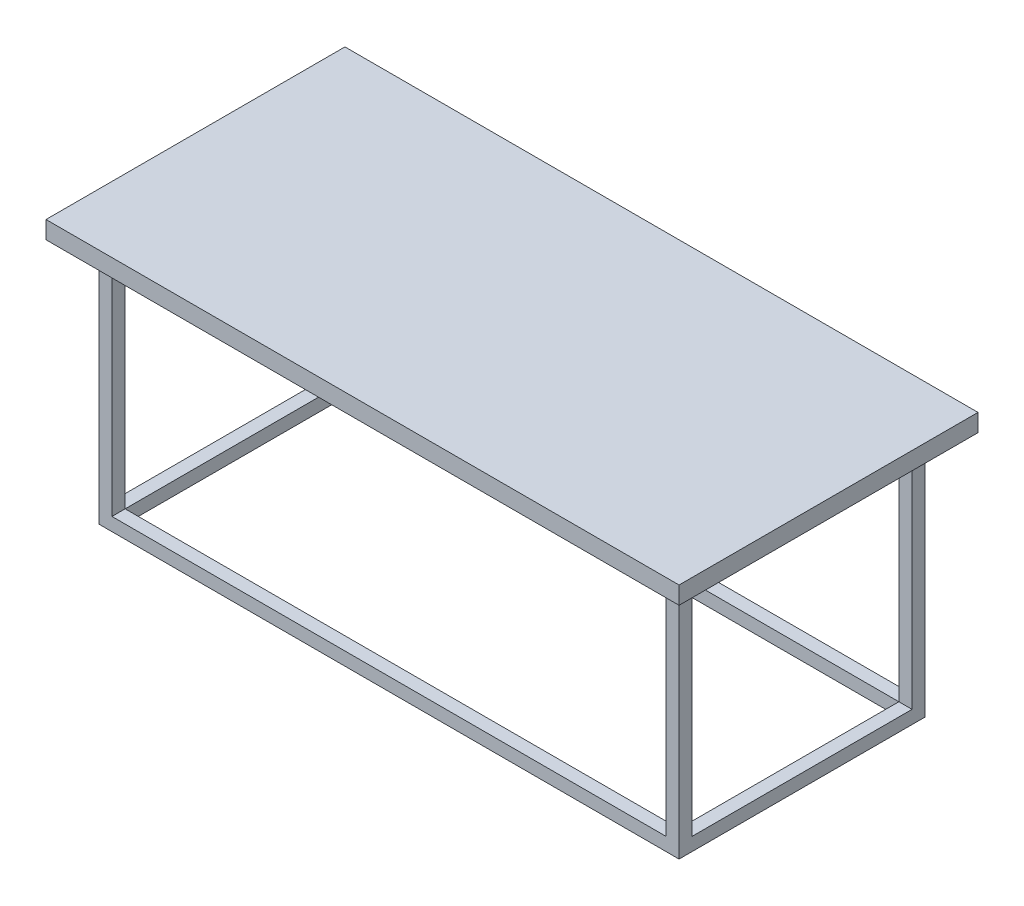
ISO-10303-21;
HEADER;
FILE_DESCRIPTION(('STEP AP214'),'2;1');
FILE_NAME('part.step','',(''),(''),'','','');
FILE_SCHEMA(('AUTOMOTIVE_DESIGN { 1 0 10303 214 1 1 1 1 }'));
ENDSEC;
DATA;
#1=APPLICATION_CONTEXT('core data for automotive mechanical design processes');
#2=APPLICATION_PROTOCOL_DEFINITION('international standard','automotive_design',2000,#1);
#3=PRODUCT_CONTEXT('',#1,'mechanical');
#4=PRODUCT('Part','Part','',(#3));
#5=PRODUCT_RELATED_PRODUCT_CATEGORY('part','',(#4));
#6=PRODUCT_DEFINITION_FORMATION('','',#4);
#7=PRODUCT_DEFINITION_CONTEXT('part definition',#1,'design');
#8=PRODUCT_DEFINITION('design','',#6,#7);
#9=PRODUCT_DEFINITION_SHAPE('','',#8);
#10=(LENGTH_UNIT() NAMED_UNIT(*) SI_UNIT(.MILLI.,.METRE.));
#11=(NAMED_UNIT(*) PLANE_ANGLE_UNIT() SI_UNIT($,.RADIAN.));
#12=(NAMED_UNIT(*) SI_UNIT($,.STERADIAN.) SOLID_ANGLE_UNIT());
#13=UNCERTAINTY_MEASURE_WITH_UNIT(LENGTH_MEASURE(1.E-05),#10,'distance_accuracy_value','');
#14=(GEOMETRIC_REPRESENTATION_CONTEXT(3) GLOBAL_UNCERTAINTY_ASSIGNED_CONTEXT((#13)) GLOBAL_UNIT_ASSIGNED_CONTEXT((#10,
#11,#12)) REPRESENTATION_CONTEXT('',''));
#15=CARTESIAN_POINT('',(0.,0.,0.));
#16=DIRECTION('',(0.,0.,1.));
#17=DIRECTION('',(1.,0.,0.));
#18=AXIS2_PLACEMENT_3D('',#15,#16,#17);
#19=CARTESIAN_POINT('',(-838.2,-711.2,317.5));
#20=DIRECTION('',(0.,0.,1.));
#21=DIRECTION('',(1.,0.,0.));
#22=AXIS2_PLACEMENT_3D('',#19,#20,#21);
#23=PLANE('',#22);
#24=DIRECTION('',(0.,-1.,0.));
#25=VECTOR('',#24,1.);
#26=CARTESIAN_POINT('',(800.1000000001,-711.2,317.499999999995));
#27=LINE('',#26,#25);
#28=CARTESIAN_POINT('',(800.1000000001,-673.1,317.499999999995));
#29=VERTEX_POINT('',#28);
#30=CARTESIAN_POINT('',(800.1000000001,-711.2,317.499999999995));
#31=VERTEX_POINT('',#30);
#32=EDGE_CURVE('E203',#29,#31,#27,.T.);
#33=ORIENTED_EDGE('',*,*,#32,.T.);
#34=DIRECTION('',(1.,0.,0.));
#35=VECTOR('',#34,1.);
#36=CARTESIAN_POINT('',(-838.2,-711.2,317.5));
#37=LINE('',#36,#35);
#38=CARTESIAN_POINT('',(-800.1,-711.2,317.5));
#39=VERTEX_POINT('',#38);
#40=EDGE_CURVE('E277',#39,#31,#37,.T.);
#41=ORIENTED_EDGE('',*,*,#40,.F.);
#42=DIRECTION('',(0.,1.,0.));
#43=VECTOR('',#42,1.);
#44=CARTESIAN_POINT('',(-800.1,-711.2,317.499999999995));
#45=LINE('',#44,#43);
#46=CARTESIAN_POINT('',(-800.1,-673.1,317.499999999995));
#47=VERTEX_POINT('',#46);
#48=EDGE_CURVE('E833',#39,#47,#45,.T.);
#49=ORIENTED_EDGE('',*,*,#48,.T.);
#50=DIRECTION('',(-1.,0.,0.));
#51=VECTOR('',#50,1.);
#52=CARTESIAN_POINT('',(500000.,-673.1,317.5));
#53=LINE('',#52,#51);
#54=EDGE_CURVE('E422',#29,#47,#53,.T.);
#55=ORIENTED_EDGE('',*,*,#54,.F.);
#56=EDGE_LOOP('',(#33,#41,#49,#55));
#57=FACE_BOUND('',#56,.T.);
#58=ADVANCED_FACE('F36',(#57),#23,.F.);
#59=DIRECTION('',(-1.,0.,0.));
#60=VECTOR('',#59,1.);
#61=CARTESIAN_POINT('',(838.2,-673.1,317.499999999995));
#62=LINE('',#61,#60);
#63=CARTESIAN_POINT('',(838.2,-673.1,317.499999999995));
#64=VERTEX_POINT('',#63);
#65=EDGE_CURVE('E842',#64,#29,#62,.T.);
#66=ORIENTED_EDGE('',*,*,#65,.T.);
#67=DIRECTION('',(0.,1.,0.));
#68=VECTOR('',#67,1.);
#69=CARTESIAN_POINT('',(800.1,-711.2,317.5));
#70=LINE('',#69,#68);
#71=CARTESIAN_POINT('',(800.1,-50.8,317.5));
#72=VERTEX_POINT('',#71);
#73=EDGE_CURVE('E270',#29,#72,#70,.T.);
#74=ORIENTED_EDGE('',*,*,#73,.T.);
#75=DIRECTION('',(1.,0.,0.));
#76=VECTOR('',#75,1.);
#77=CARTESIAN_POINT('',(838.2,-50.8,317.5));
#78=LINE('',#77,#76);
#79=CARTESIAN_POINT('',(838.2,-50.8,317.5));
#80=VERTEX_POINT('',#79);
#81=EDGE_CURVE('E264',#72,#80,#78,.T.);
#82=ORIENTED_EDGE('',*,*,#81,.T.);
#83=DIRECTION('',(0.,1.,0.));
#84=VECTOR('',#83,1.);
#85=CARTESIAN_POINT('',(838.2,-711.2,317.5));
#86=LINE('',#85,#84);
#87=EDGE_CURVE('E263',#64,#80,#86,.T.);
#88=ORIENTED_EDGE('',*,*,#87,.F.);
#89=EDGE_LOOP('',(#66,#74,#82,#88));
#90=FACE_BOUND('',#89,.T.);
#91=ADVANCED_FACE('F522',(#90),#23,.F.);
#92=CARTESIAN_POINT('',(800.1,-711.2,-317.5));
#93=DIRECTION('',(0.,0.,-1.));
#94=DIRECTION('',(-1.,0.,0.));
#95=AXIS2_PLACEMENT_3D('',#92,#93,#94);
#96=PLANE('',#95);
#97=DIRECTION('',(0.,-1.,0.));
#98=VECTOR('',#97,1.);
#99=CARTESIAN_POINT('',(800.1000000001,-711.2,-317.5));
#100=LINE('',#99,#98);
#101=CARTESIAN_POINT('',(800.1000000001,-673.1,-317.5));
#102=VERTEX_POINT('',#101);
#103=CARTESIAN_POINT('',(800.1000000001,-711.2,-317.5));
#104=VERTEX_POINT('',#103);
#105=EDGE_CURVE('E54',#102,#104,#100,.T.);
#106=ORIENTED_EDGE('',*,*,#105,.F.);
#107=DIRECTION('',(-1.,0.,0.));
#108=VECTOR('',#107,1.);
#109=CARTESIAN_POINT('',(500000.,-673.1,-317.5));
#110=LINE('',#109,#108);
#111=CARTESIAN_POINT('',(-800.1,-673.1,-317.5));
#112=VERTEX_POINT('',#111);
#113=EDGE_CURVE('E223',#102,#112,#110,.T.);
#114=ORIENTED_EDGE('',*,*,#113,.T.);
#115=DIRECTION('',(0.,1.,0.));
#116=VECTOR('',#115,1.);
#117=CARTESIAN_POINT('',(-800.1,-711.2,-317.5));
#118=LINE('',#117,#116);
#119=CARTESIAN_POINT('',(-800.1,-711.2,-317.5));
#120=VERTEX_POINT('',#119);
#121=EDGE_CURVE('E845',#120,#112,#118,.T.);
#122=ORIENTED_EDGE('',*,*,#121,.F.);
#123=DIRECTION('',(-1.,0.,0.));
#124=VECTOR('',#123,1.);
#125=CARTESIAN_POINT('',(800.1,-711.2,-317.5));
#126=LINE('',#125,#124);
#127=EDGE_CURVE('E225',#104,#120,#126,.T.);
#128=ORIENTED_EDGE('',*,*,#127,.F.);
#129=EDGE_LOOP('',(#106,#114,#122,#128));
#130=FACE_BOUND('',#129,.T.);
#131=ADVANCED_FACE('F221',(#130),#96,.F.);
#132=DIRECTION('',(-1.,0.,0.));
#133=VECTOR('',#132,1.);
#134=CARTESIAN_POINT('',(838.2,-673.1,-317.5));
#135=LINE('',#134,#133);
#136=CARTESIAN_POINT('',(838.2,-673.1,-317.5));
#137=VERTEX_POINT('',#136);
#138=EDGE_CURVE('E210',#137,#102,#135,.T.);
#139=ORIENTED_EDGE('',*,*,#138,.F.);
#140=DIRECTION('',(0.,1.,0.));
#141=VECTOR('',#140,1.);
#142=CARTESIAN_POINT('',(838.2,-711.2,-317.5));
#143=LINE('',#142,#141);
#144=CARTESIAN_POINT('',(838.2,-50.8,-317.5));
#145=VERTEX_POINT('',#144);
#146=EDGE_CURVE('E250',#137,#145,#143,.T.);
#147=ORIENTED_EDGE('',*,*,#146,.T.);
#148=DIRECTION('',(-1.,0.,0.));
#149=VECTOR('',#148,1.);
#150=CARTESIAN_POINT('',(800.1,-50.8,-317.5));
#151=LINE('',#150,#149);
#152=CARTESIAN_POINT('',(800.1,-50.8,-317.5));
#153=VERTEX_POINT('',#152);
#154=EDGE_CURVE('E249',#145,#153,#151,.T.);
#155=ORIENTED_EDGE('',*,*,#154,.T.);
#156=DIRECTION('',(0.,1.,0.));
#157=VECTOR('',#156,1.);
#158=CARTESIAN_POINT('',(800.1,-711.2,-317.5));
#159=LINE('',#158,#157);
#160=EDGE_CURVE('E241',#102,#153,#159,.T.);
#161=ORIENTED_EDGE('',*,*,#160,.F.);
#162=EDGE_LOOP('',(#139,#147,#155,#161));
#163=FACE_BOUND('',#162,.T.);
#164=ADVANCED_FACE('F247',(#163),#96,.F.);
#165=DIRECTION('',(-1.,0.,0.));
#166=VECTOR('',#165,1.);
#167=CARTESIAN_POINT('',(-838.2,-673.1,317.499999999995));
#168=LINE('',#167,#166);
#169=CARTESIAN_POINT('',(-838.2,-673.1,317.499999999995));
#170=VERTEX_POINT('',#169);
#171=EDGE_CURVE('E435',#47,#170,#168,.T.);
#172=ORIENTED_EDGE('',*,*,#171,.T.);
#173=DIRECTION('',(0.,1.,0.));
#174=VECTOR('',#173,1.);
#175=CARTESIAN_POINT('',(-838.2,-711.2,317.5));
#176=LINE('',#175,#174);
#177=CARTESIAN_POINT('',(-838.2,-50.8,317.5));
#178=VERTEX_POINT('',#177);
#179=EDGE_CURVE('E40',#170,#178,#176,.T.);
#180=ORIENTED_EDGE('',*,*,#179,.T.);
#181=DIRECTION('',(1.,0.,0.));
#182=VECTOR('',#181,1.);
#183=CARTESIAN_POINT('',(-838.2,-50.8,317.5));
#184=LINE('',#183,#182);
#185=CARTESIAN_POINT('',(-800.1,-50.8,317.5));
#186=VERTEX_POINT('',#185);
#187=EDGE_CURVE('E274',#178,#186,#184,.T.);
#188=ORIENTED_EDGE('',*,*,#187,.T.);
#189=DIRECTION('',(0.,1.,0.));
#190=VECTOR('',#189,1.);
#191=CARTESIAN_POINT('',(-800.1,-711.2,317.5));
#192=LINE('',#191,#190);
#193=EDGE_CURVE('E286',#47,#186,#192,.T.);
#194=ORIENTED_EDGE('',*,*,#193,.F.);
#195=EDGE_LOOP('',(#172,#180,#188,#194));
#196=FACE_BOUND('',#195,.T.);
#197=ADVANCED_FACE('F350',(#196),#23,.F.);
#198=DIRECTION('',(-1.,0.,0.));
#199=VECTOR('',#198,1.);
#200=CARTESIAN_POINT('',(-838.2,-673.1,-317.5));
#201=LINE('',#200,#199);
#202=CARTESIAN_POINT('',(-838.2,-673.1,-317.5));
#203=VERTEX_POINT('',#202);
#204=EDGE_CURVE('E244',#112,#203,#201,.T.);
#205=ORIENTED_EDGE('',*,*,#204,.F.);
#206=DIRECTION('',(0.,1.,0.));
#207=VECTOR('',#206,1.);
#208=CARTESIAN_POINT('',(-800.1,-711.2,-317.5));
#209=LINE('',#208,#207);
#210=CARTESIAN_POINT('',(-800.1,-50.8,-317.5));
#211=VERTEX_POINT('',#210);
#212=EDGE_CURVE('E368',#112,#211,#209,.T.);
#213=ORIENTED_EDGE('',*,*,#212,.T.);
#214=DIRECTION('',(-1.,0.,0.));
#215=VECTOR('',#214,1.);
#216=CARTESIAN_POINT('',(-838.2,-50.8,-317.5));
#217=LINE('',#216,#215);
#218=CARTESIAN_POINT('',(-838.2,-50.8,-317.5));
#219=VERTEX_POINT('',#218);
#220=EDGE_CURVE('E369',#211,#219,#217,.T.);
#221=ORIENTED_EDGE('',*,*,#220,.T.);
#222=DIRECTION('',(0.,1.,0.));
#223=VECTOR('',#222,1.);
#224=CARTESIAN_POINT('',(-838.2,-711.2,-317.5));
#225=LINE('',#224,#223);
#226=EDGE_CURVE('E363',#203,#219,#225,.T.);
#227=ORIENTED_EDGE('',*,*,#226,.F.);
#228=EDGE_LOOP('',(#205,#213,#221,#227));
#229=FACE_BOUND('',#228,.T.);
#230=ADVANCED_FACE('F532',(#229),#96,.F.);
#231=CARTESIAN_POINT('',(800.1,-711.2,-317.5));
#232=DIRECTION('',(1.,0.,0.));
#233=DIRECTION('',(0.,0.,-1.));
#234=AXIS2_PLACEMENT_3D('',#231,#232,#233);
#235=PLANE('',#234);
#236=DIRECTION('',(0.,0.,1.));
#237=VECTOR('',#236,1.);
#238=CARTESIAN_POINT('',(800.099999999986,-673.1,-317.5));
#239=LINE('',#238,#237);
#240=CARTESIAN_POINT('',(800.1000000001,-673.1,-355.6));
#241=VERTEX_POINT('',#240);
#242=EDGE_CURVE('E230',#241,#102,#239,.T.);
#243=ORIENTED_EDGE('',*,*,#242,.T.);
#244=ORIENTED_EDGE('',*,*,#160,.T.);
#245=DIRECTION('',(0.,0.,-1.));
#246=VECTOR('',#245,1.);
#247=CARTESIAN_POINT('',(800.1,-50.8,-317.5));
#248=LINE('',#247,#246);
#249=CARTESIAN_POINT('',(800.1,-50.8,-355.6));
#250=VERTEX_POINT('',#249);
#251=EDGE_CURVE('E378',#153,#250,#248,.T.);
#252=ORIENTED_EDGE('',*,*,#251,.T.);
#253=DIRECTION('',(0.,1.,0.));
#254=VECTOR('',#253,1.);
#255=CARTESIAN_POINT('',(800.1,-711.2,-355.6));
#256=LINE('',#255,#254);
#257=EDGE_CURVE('E243',#241,#250,#256,.T.);
#258=ORIENTED_EDGE('',*,*,#257,.F.);
#259=EDGE_LOOP('',(#243,#244,#252,#258));
#260=FACE_BOUND('',#259,.T.);
#261=ADVANCED_FACE('F239',(#260),#235,.F.);
#262=CARTESIAN_POINT('',(-800.1,-711.2,-355.6));
#263=DIRECTION('',(-1.,0.,0.));
#264=DIRECTION('',(0.,0.,1.));
#265=AXIS2_PLACEMENT_3D('',#262,#263,#264);
#266=PLANE('',#265);
#267=DIRECTION('',(0.,0.,1.));
#268=VECTOR('',#267,1.);
#269=CARTESIAN_POINT('',(-800.1,-673.1,-317.5));
#270=LINE('',#269,#268);
#271=CARTESIAN_POINT('',(-800.1,-673.1,-355.6));
#272=VERTEX_POINT('',#271);
#273=EDGE_CURVE('E233',#272,#112,#270,.T.);
#274=ORIENTED_EDGE('',*,*,#273,.F.);
#275=DIRECTION('',(0.,1.,0.));
#276=VECTOR('',#275,1.);
#277=CARTESIAN_POINT('',(-800.1,-711.2,-355.6));
#278=LINE('',#277,#276);
#279=CARTESIAN_POINT('',(-800.1,-50.8,-355.6));
#280=VERTEX_POINT('',#279);
#281=EDGE_CURVE('E371',#272,#280,#278,.T.);
#282=ORIENTED_EDGE('',*,*,#281,.T.);
#283=DIRECTION('',(0.,0.,1.));
#284=VECTOR('',#283,1.);
#285=CARTESIAN_POINT('',(-800.1,-50.8,-355.6));
#286=LINE('',#285,#284);
#287=EDGE_CURVE('E373',#280,#211,#286,.T.);
#288=ORIENTED_EDGE('',*,*,#287,.T.);
#289=ORIENTED_EDGE('',*,*,#212,.F.);
#290=EDGE_LOOP('',(#274,#282,#288,#289));
#291=FACE_BOUND('',#290,.T.);
#292=ADVANCED_FACE('F440',(#291),#266,.F.);
#293=CARTESIAN_POINT('',(-800.1,-711.2,355.6));
#294=DIRECTION('',(-1.,0.,0.));
#295=DIRECTION('',(0.,0.,1.));
#296=AXIS2_PLACEMENT_3D('',#293,#294,#295);
#297=PLANE('',#296);
#298=DIRECTION('',(0.,0.,1.));
#299=VECTOR('',#298,1.);
#300=CARTESIAN_POINT('',(-800.1,-673.1,355.6));
#301=LINE('',#300,#299);
#302=CARTESIAN_POINT('',(-800.1,-673.1,355.6));
#303=VERTEX_POINT('',#302);
#304=EDGE_CURVE('E417',#47,#303,#301,.T.);
#305=ORIENTED_EDGE('',*,*,#304,.F.);
#306=ORIENTED_EDGE('',*,*,#193,.T.);
#307=DIRECTION('',(0.,0.,1.));
#308=VECTOR('',#307,1.);
#309=CARTESIAN_POINT('',(-800.1,-50.8,355.6));
#310=LINE('',#309,#308);
#311=CARTESIAN_POINT('',(-800.1,-50.8,355.6));
#312=VERTEX_POINT('',#311);
#313=EDGE_CURVE('E278',#186,#312,#310,.T.);
#314=ORIENTED_EDGE('',*,*,#313,.T.);
#315=DIRECTION('',(0.,1.,0.));
#316=VECTOR('',#315,1.);
#317=CARTESIAN_POINT('',(-800.1,-711.2,355.6));
#318=LINE('',#317,#316);
#319=EDGE_CURVE('E283',#303,#312,#318,.T.);
#320=ORIENTED_EDGE('',*,*,#319,.F.);
#321=EDGE_LOOP('',(#305,#306,#314,#320));
#322=FACE_BOUND('',#321,.T.);
#323=ADVANCED_FACE('F415',(#322),#297,.F.);
#324=CARTESIAN_POINT('',(800.1,-711.2,355.6));
#325=DIRECTION('',(1.,0.,0.));
#326=DIRECTION('',(0.,0.,-1.));
#327=AXIS2_PLACEMENT_3D('',#324,#325,#326);
#328=PLANE('',#327);
#329=DIRECTION('',(0.,0.,1.));
#330=VECTOR('',#329,1.);
#331=CARTESIAN_POINT('',(800.099999999986,-673.1,355.6));
#332=LINE('',#331,#330);
#333=CARTESIAN_POINT('',(800.1000000001,-673.1,355.6));
#334=VERTEX_POINT('',#333);
#335=EDGE_CURVE('E425',#29,#334,#332,.T.);
#336=ORIENTED_EDGE('',*,*,#335,.T.);
#337=DIRECTION('',(0.,1.,0.));
#338=VECTOR('',#337,1.);
#339=CARTESIAN_POINT('',(800.1,-711.2,355.6));
#340=LINE('',#339,#338);
#341=CARTESIAN_POINT('',(800.1,-50.8,355.6));
#342=VERTEX_POINT('',#341);
#343=EDGE_CURVE('E272',#334,#342,#340,.T.);
#344=ORIENTED_EDGE('',*,*,#343,.T.);
#345=DIRECTION('',(0.,0.,-1.));
#346=VECTOR('',#345,1.);
#347=CARTESIAN_POINT('',(800.1,-50.8,355.6));
#348=LINE('',#347,#346);
#349=EDGE_CURVE('E259',#342,#72,#348,.T.);
#350=ORIENTED_EDGE('',*,*,#349,.T.);
#351=ORIENTED_EDGE('',*,*,#73,.F.);
#352=EDGE_LOOP('',(#336,#344,#350,#351));
#353=FACE_BOUND('',#352,.T.);
#354=ADVANCED_FACE('F546',(#353),#328,.F.);
#355=CARTESIAN_POINT('',(0.,-50.8,0.));
#356=DIRECTION('',(0.,-1.,0.));
#357=DIRECTION('',(0.,0.,-1.));
#358=AXIS2_PLACEMENT_3D('',#355,#356,#357);
#359=PLANE('',#358);
#360=DIRECTION('',(1.,0.,0.));
#361=VECTOR('',#360,1.);
#362=CARTESIAN_POINT('',(800.1,-50.8,-317.5));
#363=LINE('',#362,#361);
#364=EDGE_CURVE('E321',#211,#153,#363,.T.);
#365=ORIENTED_EDGE('',*,*,#364,.F.);
#366=ORIENTED_EDGE('',*,*,#287,.F.);
#367=DIRECTION('',(1.,0.,0.));
#368=VECTOR('',#367,1.);
#369=CARTESIAN_POINT('',(838.2,-50.8,-355.6));
#370=LINE('',#369,#368);
#371=EDGE_CURVE('E341',#280,#250,#370,.T.);
#372=ORIENTED_EDGE('',*,*,#371,.T.);
#373=ORIENTED_EDGE('',*,*,#251,.F.);
#374=EDGE_LOOP('',(#365,#366,#372,#373));
#375=FACE_BOUND('',#374,.T.);
#376=ADVANCED_FACE('F384',(#375),#359,.T.);
#377=DIRECTION('',(0.,0.,-1.));
#378=VECTOR('',#377,1.);
#379=CARTESIAN_POINT('',(-838.2,-50.8,-355.6));
#380=LINE('',#379,#378);
#381=EDGE_CURVE('E344',#178,#219,#380,.T.);
#382=ORIENTED_EDGE('',*,*,#381,.T.);
#383=ORIENTED_EDGE('',*,*,#220,.F.);
#384=DIRECTION('',(0.,0.,-1.));
#385=VECTOR('',#384,1.);
#386=CARTESIAN_POINT('',(-800.1,-50.8,-317.5));
#387=LINE('',#386,#385);
#388=EDGE_CURVE('E357',#186,#211,#387,.T.);
#389=ORIENTED_EDGE('',*,*,#388,.F.);
#390=ORIENTED_EDGE('',*,*,#187,.F.);
#391=EDGE_LOOP('',(#382,#383,#389,#390));
#392=FACE_BOUND('',#391,.T.);
#393=ADVANCED_FACE('F353',(#392),#359,.T.);
#394=DIRECTION('',(0.,0.,1.));
#395=VECTOR('',#394,1.);
#396=CARTESIAN_POINT('',(800.1,-50.8,-317.5));
#397=LINE('',#396,#395);
#398=EDGE_CURVE('E328',#153,#72,#397,.T.);
#399=ORIENTED_EDGE('',*,*,#398,.F.);
#400=ORIENTED_EDGE('',*,*,#154,.F.);
#401=DIRECTION('',(0.,0.,1.));
#402=VECTOR('',#401,1.);
#403=CARTESIAN_POINT('',(838.2,-50.8,-355.6));
#404=LINE('',#403,#402);
#405=EDGE_CURVE('E443',#145,#80,#404,.T.);
#406=ORIENTED_EDGE('',*,*,#405,.T.);
#407=ORIENTED_EDGE('',*,*,#81,.F.);
#408=EDGE_LOOP('',(#399,#400,#406,#407));
#409=FACE_BOUND('',#408,.T.);
#410=ADVANCED_FACE('F400',(#409),#359,.T.);
#411=DIRECTION('',(-1.,0.,0.));
#412=VECTOR('',#411,1.);
#413=CARTESIAN_POINT('',(800.1,-50.8,317.5));
#414=LINE('',#413,#412);
#415=EDGE_CURVE('E402',#72,#186,#414,.T.);
#416=ORIENTED_EDGE('',*,*,#415,.F.);
#417=ORIENTED_EDGE('',*,*,#349,.F.);
#418=DIRECTION('',(-1.,0.,0.));
#419=VECTOR('',#418,1.);
#420=CARTESIAN_POINT('',(838.2,-50.8,355.6));
#421=LINE('',#420,#419);
#422=EDGE_CURVE('E295',#342,#312,#421,.T.);
#423=ORIENTED_EDGE('',*,*,#422,.T.);
#424=ORIENTED_EDGE('',*,*,#313,.F.);
#425=EDGE_LOOP('',(#416,#417,#423,#424));
#426=FACE_BOUND('',#425,.T.);
#427=ADVANCED_FACE('F414',(#426),#359,.T.);
#428=CARTESIAN_POINT('',(0.,0.,0.));
#429=DIRECTION('',(0.,1.,0.));
#430=DIRECTION('',(0.,0.,1.));
#431=AXIS2_PLACEMENT_3D('',#428,#429,#430);
#432=PLANE('',#431);
#433=DIRECTION('',(0.,0.,1.));
#434=VECTOR('',#433,1.);
#435=CARTESIAN_POINT('',(-914.4,0.,431.8));
#436=LINE('',#435,#434);
#437=CARTESIAN_POINT('',(-914.4,0.,-431.8));
#438=VERTEX_POINT('',#437);
#439=CARTESIAN_POINT('',(-914.4,0.,431.8));
#440=VERTEX_POINT('',#439);
#441=EDGE_CURVE('E469',#438,#440,#436,.T.);
#442=ORIENTED_EDGE('',*,*,#441,.F.);
#443=DIRECTION('',(-1.,0.,0.));
#444=VECTOR('',#443,1.);
#445=CARTESIAN_POINT('',(914.4,0.,-431.8));
#446=LINE('',#445,#444);
#447=CARTESIAN_POINT('',(914.4,0.,-431.8));
#448=VERTEX_POINT('',#447);
#449=EDGE_CURVE('E474',#448,#438,#446,.T.);
#450=ORIENTED_EDGE('',*,*,#449,.F.);
#451=DIRECTION('',(0.,0.,-1.));
#452=VECTOR('',#451,1.);
#453=CARTESIAN_POINT('',(914.4,0.,431.8));
#454=LINE('',#453,#452);
#455=CARTESIAN_POINT('',(914.4,0.,431.8));
#456=VERTEX_POINT('',#455);
#457=EDGE_CURVE('E485',#456,#448,#454,.T.);
#458=ORIENTED_EDGE('',*,*,#457,.F.);
#459=DIRECTION('',(1.,0.,0.));
#460=VECTOR('',#459,1.);
#461=CARTESIAN_POINT('',(914.4,0.,431.8));
#462=LINE('',#461,#460);
#463=EDGE_CURVE('E483',#440,#456,#462,.T.);
#464=ORIENTED_EDGE('',*,*,#463,.F.);
#465=EDGE_LOOP('',(#442,#450,#458,#464));
#466=FACE_BOUND('',#465,.T.);
#467=DIRECTION('',(0.,0.,-1.));
#468=VECTOR('',#467,1.);
#469=CARTESIAN_POINT('',(-838.2,0.,-355.6));
#470=LINE('',#469,#468);
#471=CARTESIAN_POINT('',(-838.2,0.,355.6));
#472=VERTEX_POINT('',#471);
#473=CARTESIAN_POINT('',(-838.2,0.,-355.6));
#474=VERTEX_POINT('',#473);
#475=EDGE_CURVE('E338',#472,#474,#470,.T.);
#476=ORIENTED_EDGE('',*,*,#475,.F.);
#477=DIRECTION('',(-1.,0.,0.));
#478=VECTOR('',#477,1.);
#479=CARTESIAN_POINT('',(838.2,0.,355.6));
#480=LINE('',#479,#478);
#481=CARTESIAN_POINT('',(838.2,0.,355.6));
#482=VERTEX_POINT('',#481);
#483=EDGE_CURVE('E347',#482,#472,#480,.T.);
#484=ORIENTED_EDGE('',*,*,#483,.F.);
#485=DIRECTION('',(0.,0.,1.));
#486=VECTOR('',#485,1.);
#487=CARTESIAN_POINT('',(838.2,0.,-355.6));
#488=LINE('',#487,#486);
#489=CARTESIAN_POINT('',(838.2,0.,-355.6));
#490=VERTEX_POINT('',#489);
#491=EDGE_CURVE('E453',#490,#482,#488,.T.);
#492=ORIENTED_EDGE('',*,*,#491,.F.);
#493=DIRECTION('',(1.,0.,0.));
#494=VECTOR('',#493,1.);
#495=CARTESIAN_POINT('',(838.2,0.,-355.6));
#496=LINE('',#495,#494);
#497=EDGE_CURVE('E450',#474,#490,#496,.T.);
#498=ORIENTED_EDGE('',*,*,#497,.F.);
#499=EDGE_LOOP('',(#476,#484,#492,#498));
#500=FACE_BOUND('',#499,.T.);
#501=ADVANCED_FACE('F503',(#466,#500),#432,.F.);
#502=CARTESIAN_POINT('',(-914.4,50.8,431.8));
#503=DIRECTION('',(1.,0.,0.));
#504=DIRECTION('',(0.,0.,-1.));
#505=AXIS2_PLACEMENT_3D('',#502,#503,#504);
#506=PLANE('',#505);
#507=ORIENTED_EDGE('',*,*,#441,.T.);
#508=DIRECTION('',(0.,-1.,0.));
#509=VECTOR('',#508,1.);
#510=CARTESIAN_POINT('',(-914.4,50.8,431.8));
#511=LINE('',#510,#509);
#512=CARTESIAN_POINT('',(-914.4,50.8,431.8));
#513=VERTEX_POINT('',#512);
#514=EDGE_CURVE('E11',#513,#440,#511,.T.);
#515=ORIENTED_EDGE('',*,*,#514,.F.);
#516=DIRECTION('',(0.,0.,1.));
#517=VECTOR('',#516,1.);
#518=CARTESIAN_POINT('',(-914.4,50.8,431.8));
#519=LINE('',#518,#517);
#520=CARTESIAN_POINT('',(-914.4,50.8,-431.8));
#521=VERTEX_POINT('',#520);
#522=EDGE_CURVE('E470',#521,#513,#519,.T.);
#523=ORIENTED_EDGE('',*,*,#522,.F.);
#524=DIRECTION('',(0.,-1.,0.));
#525=VECTOR('',#524,1.);
#526=CARTESIAN_POINT('',(-914.4,50.8,-431.8));
#527=LINE('',#526,#525);
#528=EDGE_CURVE('E480',#521,#438,#527,.T.);
#529=ORIENTED_EDGE('',*,*,#528,.T.);
#530=EDGE_LOOP('',(#507,#515,#523,#529));
#531=FACE_BOUND('',#530,.T.);
#532=ADVANCED_FACE('F38',(#531),#506,.F.);
#533=CARTESIAN_POINT('',(914.4,50.8,431.8));
#534=DIRECTION('',(0.,0.,-1.));
#535=DIRECTION('',(-1.,0.,0.));
#536=AXIS2_PLACEMENT_3D('',#533,#534,#535);
#537=PLANE('',#536);
#538=ORIENTED_EDGE('',*,*,#463,.T.);
#539=DIRECTION('',(0.,-1.,0.));
#540=VECTOR('',#539,1.);
#541=CARTESIAN_POINT('',(914.4,50.8,431.8));
#542=LINE('',#541,#540);
#543=CARTESIAN_POINT('',(914.4,50.8,431.8));
#544=VERTEX_POINT('',#543);
#545=EDGE_CURVE('E46',#544,#456,#542,.T.);
#546=ORIENTED_EDGE('',*,*,#545,.F.);
#547=DIRECTION('',(1.,0.,0.));
#548=VECTOR('',#547,1.);
#549=CARTESIAN_POINT('',(914.4,50.8,431.8));
#550=LINE('',#549,#548);
#551=EDGE_CURVE('E473',#513,#544,#550,.T.);
#552=ORIENTED_EDGE('',*,*,#551,.F.);
#553=ORIENTED_EDGE('',*,*,#514,.T.);
#554=EDGE_LOOP('',(#538,#546,#552,#553));
#555=FACE_BOUND('',#554,.T.);
#556=ADVANCED_FACE('F514',(#555),#537,.F.);
#557=CARTESIAN_POINT('',(914.4,50.8,431.8));
#558=DIRECTION('',(-1.,0.,0.));
#559=DIRECTION('',(0.,0.,1.));
#560=AXIS2_PLACEMENT_3D('',#557,#558,#559);
#561=PLANE('',#560);
#562=ORIENTED_EDGE('',*,*,#457,.T.);
#563=DIRECTION('',(0.,-1.,0.));
#564=VECTOR('',#563,1.);
#565=CARTESIAN_POINT('',(914.4,50.8,-431.8));
#566=LINE('',#565,#564);
#567=CARTESIAN_POINT('',(914.4,50.8,-431.8));
#568=VERTEX_POINT('',#567);
#569=EDGE_CURVE('E490',#568,#448,#566,.T.);
#570=ORIENTED_EDGE('',*,*,#569,.F.);
#571=DIRECTION('',(0.,0.,-1.));
#572=VECTOR('',#571,1.);
#573=CARTESIAN_POINT('',(914.4,50.8,431.8));
#574=LINE('',#573,#572);
#575=EDGE_CURVE('E476',#544,#568,#574,.T.);
#576=ORIENTED_EDGE('',*,*,#575,.F.);
#577=ORIENTED_EDGE('',*,*,#545,.T.);
#578=EDGE_LOOP('',(#562,#570,#576,#577));
#579=FACE_BOUND('',#578,.T.);
#580=ADVANCED_FACE('F497',(#579),#561,.F.);
#581=CARTESIAN_POINT('',(914.4,50.8,-431.8));
#582=DIRECTION('',(0.,0.,1.));
#583=DIRECTION('',(1.,0.,0.));
#584=AXIS2_PLACEMENT_3D('',#581,#582,#583);
#585=PLANE('',#584);
#586=ORIENTED_EDGE('',*,*,#449,.T.);
#587=ORIENTED_EDGE('',*,*,#528,.F.);
#588=DIRECTION('',(-1.,0.,0.));
#589=VECTOR('',#588,1.);
#590=CARTESIAN_POINT('',(914.4,50.8,-431.8));
#591=LINE('',#590,#589);
#592=EDGE_CURVE('E478',#568,#521,#591,.T.);
#593=ORIENTED_EDGE('',*,*,#592,.F.);
#594=ORIENTED_EDGE('',*,*,#569,.T.);
#595=EDGE_LOOP('',(#586,#587,#593,#594));
#596=FACE_BOUND('',#595,.T.);
#597=ADVANCED_FACE('F507',(#596),#585,.F.);
#598=CARTESIAN_POINT('',(0.,50.8,0.));
#599=DIRECTION('',(0.,1.,0.));
#600=DIRECTION('',(0.,0.,1.));
#601=AXIS2_PLACEMENT_3D('',#598,#599,#600);
#602=PLANE('',#601);
#603=ORIENTED_EDGE('',*,*,#522,.T.);
#604=ORIENTED_EDGE('',*,*,#551,.T.);
#605=ORIENTED_EDGE('',*,*,#575,.T.);
#606=ORIENTED_EDGE('',*,*,#592,.T.);
#607=EDGE_LOOP('',(#603,#604,#605,#606));
#608=FACE_BOUND('',#607,.T.);
#609=ADVANCED_FACE('F513',(#608),#602,.T.);
#610=CARTESIAN_POINT('',(-838.2,-50.8,-355.6));
#611=DIRECTION('',(1.,0.,0.));
#612=DIRECTION('',(0.,0.,-1.));
#613=AXIS2_PLACEMENT_3D('',#610,#611,#612);
#614=PLANE('',#613);
#615=ORIENTED_EDGE('',*,*,#179,.F.);
#616=DIRECTION('',(0.,0.,-1.));
#617=VECTOR('',#616,1.);
#618=CARTESIAN_POINT('',(-838.2,-673.1,500000.));
#619=LINE('',#618,#617);
#620=EDGE_CURVE('E364',#170,#203,#619,.T.);
#621=ORIENTED_EDGE('',*,*,#620,.T.);
#622=ORIENTED_EDGE('',*,*,#226,.T.);
#623=ORIENTED_EDGE('',*,*,#381,.F.);
#624=EDGE_LOOP('',(#615,#621,#622,#623));
#625=FACE_BOUND('',#624,.T.);
#626=ORIENTED_EDGE('',*,*,#475,.T.);
#627=DIRECTION('',(0.,1.,0.));
#628=VECTOR('',#627,1.);
#629=CARTESIAN_POINT('',(-838.2,-50.8,-355.6));
#630=LINE('',#629,#628);
#631=CARTESIAN_POINT('',(-838.2,-711.2,-355.6));
#632=VERTEX_POINT('',#631);
#633=EDGE_CURVE('E466',#632,#474,#630,.T.);
#634=ORIENTED_EDGE('',*,*,#633,.F.);
#635=DIRECTION('',(0.,0.,-1.));
#636=VECTOR('',#635,1.);
#637=CARTESIAN_POINT('',(-838.2,-711.2,355.6));
#638=LINE('',#637,#636);
#639=CARTESIAN_POINT('',(-838.2,-711.2,355.6));
#640=VERTEX_POINT('',#639);
#641=EDGE_CURVE('E275',#640,#632,#638,.T.);
#642=ORIENTED_EDGE('',*,*,#641,.F.);
#643=DIRECTION('',(0.,1.,0.));
#644=VECTOR('',#643,1.);
#645=CARTESIAN_POINT('',(-838.2,-50.8,355.6));
#646=LINE('',#645,#644);
#647=EDGE_CURVE('E445',#640,#472,#646,.T.);
#648=ORIENTED_EDGE('',*,*,#647,.T.);
#649=EDGE_LOOP('',(#626,#634,#642,#648));
#650=FACE_BOUND('',#649,.T.);
#651=ADVANCED_FACE('F360',(#625,#650),#614,.F.);
#652=CARTESIAN_POINT('',(838.2,-50.8,-355.6));
#653=DIRECTION('',(0.,0.,1.));
#654=DIRECTION('',(1.,0.,0.));
#655=AXIS2_PLACEMENT_3D('',#652,#653,#654);
#656=PLANE('',#655);
#657=DIRECTION('',(-1.,0.,0.));
#658=VECTOR('',#657,1.);
#659=CARTESIAN_POINT('',(500000.,-673.1,-355.6));
#660=LINE('',#659,#658);
#661=EDGE_CURVE('E235',#241,#272,#660,.T.);
#662=ORIENTED_EDGE('',*,*,#661,.F.);
#663=ORIENTED_EDGE('',*,*,#257,.T.);
#664=ORIENTED_EDGE('',*,*,#371,.F.);
#665=ORIENTED_EDGE('',*,*,#281,.F.);
#666=EDGE_LOOP('',(#662,#663,#664,#665));
#667=FACE_BOUND('',#666,.T.);
#668=ORIENTED_EDGE('',*,*,#497,.T.);
#669=DIRECTION('',(0.,1.,0.));
#670=VECTOR('',#669,1.);
#671=CARTESIAN_POINT('',(838.2,-50.8,-355.6));
#672=LINE('',#671,#670);
#673=CARTESIAN_POINT('',(838.2,-711.2,-355.6));
#674=VERTEX_POINT('',#673);
#675=EDGE_CURVE('E463',#674,#490,#672,.T.);
#676=ORIENTED_EDGE('',*,*,#675,.F.);
#677=DIRECTION('',(1.,0.,0.));
#678=VECTOR('',#677,1.);
#679=CARTESIAN_POINT('',(800.1,-711.2,-355.6));
#680=LINE('',#679,#678);
#681=EDGE_CURVE('E253',#632,#674,#680,.T.);
#682=ORIENTED_EDGE('',*,*,#681,.F.);
#683=ORIENTED_EDGE('',*,*,#633,.T.);
#684=EDGE_LOOP('',(#668,#676,#682,#683));
#685=FACE_BOUND('',#684,.T.);
#686=ADVANCED_FACE('F441',(#667,#685),#656,.F.);
#687=CARTESIAN_POINT('',(838.2,-50.8,-355.6));
#688=DIRECTION('',(-1.,0.,0.));
#689=DIRECTION('',(0.,0.,1.));
#690=AXIS2_PLACEMENT_3D('',#687,#688,#689);
#691=PLANE('',#690);
#692=DIRECTION('',(0.,0.,-1.));
#693=VECTOR('',#692,1.);
#694=CARTESIAN_POINT('',(838.2,-673.1,500000.));
#695=LINE('',#694,#693);
#696=EDGE_CURVE('E206',#64,#137,#695,.T.);
#697=ORIENTED_EDGE('',*,*,#696,.F.);
#698=ORIENTED_EDGE('',*,*,#87,.T.);
#699=ORIENTED_EDGE('',*,*,#405,.F.);
#700=ORIENTED_EDGE('',*,*,#146,.F.);
#701=EDGE_LOOP('',(#697,#698,#699,#700));
#702=FACE_BOUND('',#701,.T.);
#703=ORIENTED_EDGE('',*,*,#491,.T.);
#704=DIRECTION('',(0.,1.,0.));
#705=VECTOR('',#704,1.);
#706=CARTESIAN_POINT('',(838.2,-50.8,355.6));
#707=LINE('',#706,#705);
#708=CARTESIAN_POINT('',(838.2,-711.2,355.6));
#709=VERTEX_POINT('',#708);
#710=EDGE_CURVE('E460',#709,#482,#707,.T.);
#711=ORIENTED_EDGE('',*,*,#710,.F.);
#712=DIRECTION('',(0.,0.,1.));
#713=VECTOR('',#712,1.);
#714=CARTESIAN_POINT('',(838.2,-711.2,355.6));
#715=LINE('',#714,#713);
#716=EDGE_CURVE('E260',#674,#709,#715,.T.);
#717=ORIENTED_EDGE('',*,*,#716,.F.);
#718=ORIENTED_EDGE('',*,*,#675,.T.);
#719=EDGE_LOOP('',(#703,#711,#717,#718));
#720=FACE_BOUND('',#719,.T.);
#721=ADVANCED_FACE('F614',(#702,#720),#691,.F.);
#722=CARTESIAN_POINT('',(838.2,-50.8,355.6));
#723=DIRECTION('',(0.,0.,-1.));
#724=DIRECTION('',(-1.,0.,0.));
#725=AXIS2_PLACEMENT_3D('',#722,#723,#724);
#726=PLANE('',#725);
#727=DIRECTION('',(-1.,0.,0.));
#728=VECTOR('',#727,1.);
#729=CARTESIAN_POINT('',(500000.,-673.1,355.6));
#730=LINE('',#729,#728);
#731=EDGE_CURVE('E420',#334,#303,#730,.T.);
#732=ORIENTED_EDGE('',*,*,#731,.T.);
#733=ORIENTED_EDGE('',*,*,#319,.T.);
#734=ORIENTED_EDGE('',*,*,#422,.F.);
#735=ORIENTED_EDGE('',*,*,#343,.F.);
#736=EDGE_LOOP('',(#732,#733,#734,#735));
#737=FACE_BOUND('',#736,.T.);
#738=ORIENTED_EDGE('',*,*,#483,.T.);
#739=ORIENTED_EDGE('',*,*,#647,.F.);
#740=DIRECTION('',(-1.,0.,0.));
#741=VECTOR('',#740,1.);
#742=CARTESIAN_POINT('',(-838.2,-711.2,355.6));
#743=LINE('',#742,#741);
#744=EDGE_CURVE('E280',#709,#640,#743,.T.);
#745=ORIENTED_EDGE('',*,*,#744,.F.);
#746=ORIENTED_EDGE('',*,*,#710,.T.);
#747=EDGE_LOOP('',(#738,#739,#745,#746));
#748=FACE_BOUND('',#747,.T.);
#749=ADVANCED_FACE('F609',(#737,#748),#726,.F.);
#750=CARTESIAN_POINT('',(800.1,-50.8,-317.5));
#751=DIRECTION('',(-1.,0.,0.));
#752=DIRECTION('',(0.,0.,1.));
#753=AXIS2_PLACEMENT_3D('',#750,#751,#752);
#754=PLANE('',#753);
#755=DIRECTION('',(0.,0.,1.));
#756=VECTOR('',#755,1.);
#757=CARTESIAN_POINT('',(800.1,0.,-317.5));
#758=LINE('',#757,#756);
#759=CARTESIAN_POINT('',(800.1,0.,-317.5));
#760=VERTEX_POINT('',#759);
#761=CARTESIAN_POINT('',(800.1,0.,317.5));
#762=VERTEX_POINT('',#761);
#763=EDGE_CURVE('E305',#760,#762,#758,.T.);
#764=ORIENTED_EDGE('',*,*,#763,.F.);
#765=DIRECTION('',(0.,1.,0.));
#766=VECTOR('',#765,1.);
#767=CARTESIAN_POINT('',(800.1,-50.8,-317.5));
#768=LINE('',#767,#766);
#769=EDGE_CURVE('E329',#153,#760,#768,.T.);
#770=ORIENTED_EDGE('',*,*,#769,.F.);
#771=ORIENTED_EDGE('',*,*,#398,.T.);
#772=DIRECTION('',(0.,1.,0.));
#773=VECTOR('',#772,1.);
#774=CARTESIAN_POINT('',(800.1,-50.8,317.5));
#775=LINE('',#774,#773);
#776=EDGE_CURVE('E335',#72,#762,#775,.T.);
#777=ORIENTED_EDGE('',*,*,#776,.T.);
#778=EDGE_LOOP('',(#764,#770,#771,#777));
#779=FACE_BOUND('',#778,.T.);
#780=ADVANCED_FACE('F396',(#779),#754,.T.);
#781=CARTESIAN_POINT('',(800.1,-50.8,317.5));
#782=DIRECTION('',(0.,0.,-1.));
#783=DIRECTION('',(-1.,0.,0.));
#784=AXIS2_PLACEMENT_3D('',#781,#782,#783);
#785=PLANE('',#784);
#786=DIRECTION('',(-1.,0.,0.));
#787=VECTOR('',#786,1.);
#788=CARTESIAN_POINT('',(800.1,0.,317.5));
#789=LINE('',#788,#787);
#790=CARTESIAN_POINT('',(-800.1,0.,317.5));
#791=VERTEX_POINT('',#790);
#792=EDGE_CURVE('E312',#762,#791,#789,.T.);
#793=ORIENTED_EDGE('',*,*,#792,.F.);
#794=ORIENTED_EDGE('',*,*,#776,.F.);
#795=ORIENTED_EDGE('',*,*,#415,.T.);
#796=DIRECTION('',(0.,1.,0.));
#797=VECTOR('',#796,1.);
#798=CARTESIAN_POINT('',(-800.1,-50.8,317.5));
#799=LINE('',#798,#797);
#800=EDGE_CURVE('E333',#186,#791,#799,.T.);
#801=ORIENTED_EDGE('',*,*,#800,.T.);
#802=EDGE_LOOP('',(#793,#794,#795,#801));
#803=FACE_BOUND('',#802,.T.);
#804=ADVANCED_FACE('F411',(#803),#785,.T.);
#805=CARTESIAN_POINT('',(-800.1,-50.8,-317.5));
#806=DIRECTION('',(1.,0.,0.));
#807=DIRECTION('',(0.,0.,-1.));
#808=AXIS2_PLACEMENT_3D('',#805,#806,#807);
#809=PLANE('',#808);
#810=DIRECTION('',(0.,0.,-1.));
#811=VECTOR('',#810,1.);
#812=CARTESIAN_POINT('',(-800.1,0.,-317.5));
#813=LINE('',#812,#811);
#814=CARTESIAN_POINT('',(-800.1,0.,-317.5));
#815=VERTEX_POINT('',#814);
#816=EDGE_CURVE('E318',#791,#815,#813,.T.);
#817=ORIENTED_EDGE('',*,*,#816,.F.);
#818=ORIENTED_EDGE('',*,*,#800,.F.);
#819=ORIENTED_EDGE('',*,*,#388,.T.);
#820=DIRECTION('',(0.,1.,0.));
#821=VECTOR('',#820,1.);
#822=CARTESIAN_POINT('',(-800.1,-50.8,-317.5));
#823=LINE('',#822,#821);
#824=EDGE_CURVE('E331',#211,#815,#823,.T.);
#825=ORIENTED_EDGE('',*,*,#824,.T.);
#826=EDGE_LOOP('',(#817,#818,#819,#825));
#827=FACE_BOUND('',#826,.T.);
#828=ADVANCED_FACE('F407',(#827),#809,.T.);
#829=CARTESIAN_POINT('',(800.1,-50.8,-317.5));
#830=DIRECTION('',(0.,0.,1.));
#831=DIRECTION('',(1.,0.,0.));
#832=AXIS2_PLACEMENT_3D('',#829,#830,#831);
#833=PLANE('',#832);
#834=DIRECTION('',(1.,0.,0.));
#835=VECTOR('',#834,1.);
#836=CARTESIAN_POINT('',(800.1,0.,-317.5));
#837=LINE('',#836,#835);
#838=EDGE_CURVE('E326',#815,#760,#837,.T.);
#839=ORIENTED_EDGE('',*,*,#838,.F.);
#840=ORIENTED_EDGE('',*,*,#824,.F.);
#841=ORIENTED_EDGE('',*,*,#364,.T.);
#842=ORIENTED_EDGE('',*,*,#769,.T.);
#843=EDGE_LOOP('',(#839,#840,#841,#842));
#844=FACE_BOUND('',#843,.T.);
#845=ADVANCED_FACE('F392',(#844),#833,.T.);
#846=ORIENTED_EDGE('',*,*,#838,.T.);
#847=ORIENTED_EDGE('',*,*,#763,.T.);
#848=ORIENTED_EDGE('',*,*,#792,.T.);
#849=ORIENTED_EDGE('',*,*,#816,.T.);
#850=EDGE_LOOP('',(#846,#847,#848,#849));
#851=FACE_BOUND('',#850,.T.);
#852=ADVANCED_FACE('F552',(#851),#432,.F.);
#853=CARTESIAN_POINT('',(0.,-711.2,0.));
#854=DIRECTION('',(0.,-1.,0.));
#855=DIRECTION('',(0.,0.,-1.));
#856=AXIS2_PLACEMENT_3D('',#853,#854,#855);
#857=PLANE('',#856);
#858=ORIENTED_EDGE('',*,*,#681,.T.);
#859=ORIENTED_EDGE('',*,*,#716,.T.);
#860=ORIENTED_EDGE('',*,*,#744,.T.);
#861=ORIENTED_EDGE('',*,*,#641,.T.);
#862=EDGE_LOOP('',(#858,#859,#860,#861));
#863=FACE_BOUND('',#862,.T.);
#864=ORIENTED_EDGE('',*,*,#40,.T.);
#865=DIRECTION('',(0.,0.,-1.));
#866=VECTOR('',#865,1.);
#867=CARTESIAN_POINT('',(800.1000000001,-711.2,500000.));
#868=LINE('',#867,#866);
#869=EDGE_CURVE('E207',#31,#104,#868,.T.);
#870=ORIENTED_EDGE('',*,*,#869,.T.);
#871=ORIENTED_EDGE('',*,*,#127,.T.);
#872=DIRECTION('',(0.,0.,-1.));
#873=VECTOR('',#872,1.);
#874=CARTESIAN_POINT('',(-800.1,-711.2,500000.));
#875=LINE('',#874,#873);
#876=EDGE_CURVE('E62',#39,#120,#875,.T.);
#877=ORIENTED_EDGE('',*,*,#876,.F.);
#878=EDGE_LOOP('',(#864,#870,#871,#877));
#879=FACE_BOUND('',#878,.T.);
#880=ADVANCED_FACE('F549',(#863,#879),#857,.T.);
#881=CARTESIAN_POINT('',(500000.,-673.1,355.6));
#882=DIRECTION('',(0.,-1.,0.));
#883=DIRECTION('',(0.,0.,-1.));
#884=AXIS2_PLACEMENT_3D('',#881,#882,#883);
#885=PLANE('',#884);
#886=ORIENTED_EDGE('',*,*,#335,.F.);
#887=ORIENTED_EDGE('',*,*,#54,.T.);
#888=ORIENTED_EDGE('',*,*,#304,.T.);
#889=ORIENTED_EDGE('',*,*,#731,.F.);
#890=EDGE_LOOP('',(#886,#887,#888,#889));
#891=FACE_BOUND('',#890,.T.);
#892=ADVANCED_FACE('F551',(#891),#885,.F.);
#893=CARTESIAN_POINT('',(500000.,-673.1,-317.5));
#894=DIRECTION('',(0.,-1.,0.));
#895=DIRECTION('',(0.,0.,-1.));
#896=AXIS2_PLACEMENT_3D('',#893,#894,#895);
#897=PLANE('',#896);
#898=ORIENTED_EDGE('',*,*,#242,.F.);
#899=ORIENTED_EDGE('',*,*,#661,.T.);
#900=ORIENTED_EDGE('',*,*,#273,.T.);
#901=ORIENTED_EDGE('',*,*,#113,.F.);
#902=EDGE_LOOP('',(#898,#899,#900,#901));
#903=FACE_BOUND('',#902,.T.);
#904=ADVANCED_FACE('F229',(#903),#897,.F.);
#905=CARTESIAN_POINT('',(-838.2,-673.1,500000.));
#906=DIRECTION('',(0.,-1.,0.));
#907=DIRECTION('',(0.,0.,-1.));
#908=AXIS2_PLACEMENT_3D('',#905,#906,#907);
#909=PLANE('',#908);
#910=ORIENTED_EDGE('',*,*,#171,.F.);
#911=DIRECTION('',(0.,0.,-1.));
#912=VECTOR('',#911,1.);
#913=CARTESIAN_POINT('',(-800.1,-673.1,500000.));
#914=LINE('',#913,#912);
#915=EDGE_CURVE('E836',#47,#112,#914,.T.);
#916=ORIENTED_EDGE('',*,*,#915,.T.);
#917=ORIENTED_EDGE('',*,*,#204,.T.);
#918=ORIENTED_EDGE('',*,*,#620,.F.);
#919=EDGE_LOOP('',(#910,#916,#917,#918));
#920=FACE_BOUND('',#919,.T.);
#921=ADVANCED_FACE('F792',(#920),#909,.F.);
#922=CARTESIAN_POINT('',(-800.1,-711.2,500000.));
#923=DIRECTION('',(-1.,0.,0.));
#924=DIRECTION('',(0.,0.,1.));
#925=AXIS2_PLACEMENT_3D('',#922,#923,#924);
#926=PLANE('',#925);
#927=ORIENTED_EDGE('',*,*,#48,.F.);
#928=ORIENTED_EDGE('',*,*,#876,.T.);
#929=ORIENTED_EDGE('',*,*,#121,.T.);
#930=ORIENTED_EDGE('',*,*,#915,.F.);
#931=EDGE_LOOP('',(#927,#928,#929,#930));
#932=FACE_BOUND('',#931,.T.);
#933=ADVANCED_FACE('F794',(#932),#926,.F.);
#934=CARTESIAN_POINT('',(800.1000000001,-711.2,500000.));
#935=DIRECTION('',(1.,0.,0.));
#936=DIRECTION('',(0.,0.,-1.));
#937=AXIS2_PLACEMENT_3D('',#934,#935,#936);
#938=PLANE('',#937);
#939=ORIENTED_EDGE('',*,*,#32,.F.);
#940=DIRECTION('',(0.,0.,-1.));
#941=VECTOR('',#940,1.);
#942=CARTESIAN_POINT('',(800.1000000001,-673.1,500000.));
#943=LINE('',#942,#941);
#944=EDGE_CURVE('E199',#29,#102,#943,.T.);
#945=ORIENTED_EDGE('',*,*,#944,.T.);
#946=ORIENTED_EDGE('',*,*,#105,.T.);
#947=ORIENTED_EDGE('',*,*,#869,.F.);
#948=EDGE_LOOP('',(#939,#945,#946,#947));
#949=FACE_BOUND('',#948,.T.);
#950=ADVANCED_FACE('F201',(#949),#938,.F.);
#951=CARTESIAN_POINT('',(838.2,-673.1,500000.));
#952=DIRECTION('',(0.,-1.,0.));
#953=DIRECTION('',(0.,0.,-1.));
#954=AXIS2_PLACEMENT_3D('',#951,#952,#953);
#955=PLANE('',#954);
#956=ORIENTED_EDGE('',*,*,#65,.F.);
#957=ORIENTED_EDGE('',*,*,#696,.T.);
#958=ORIENTED_EDGE('',*,*,#138,.T.);
#959=ORIENTED_EDGE('',*,*,#944,.F.);
#960=EDGE_LOOP('',(#956,#957,#958,#959));
#961=FACE_BOUND('',#960,.T.);
#962=ADVANCED_FACE('F211',(#961),#955,.F.);
#963=CLOSED_SHELL('',(#58,#91,#131,#164,#197,#230,#261,#292,#323,#354,#376,#393,#410,#427,#501,
#532,#556,#580,#597,#609,#651,#686,#721,#749,#780,#804,#828,#845,#852,#880,#892,#904,#921,#933,
#950,#962));
#964=MANIFOLD_SOLID_BREP('B2',#963);
#965=ADVANCED_BREP_SHAPE_REPRESENTATION('',(#18,#964),#14);
#966=SHAPE_DEFINITION_REPRESENTATION(#9,#965);
ENDSEC;
END-ISO-10303-21;
